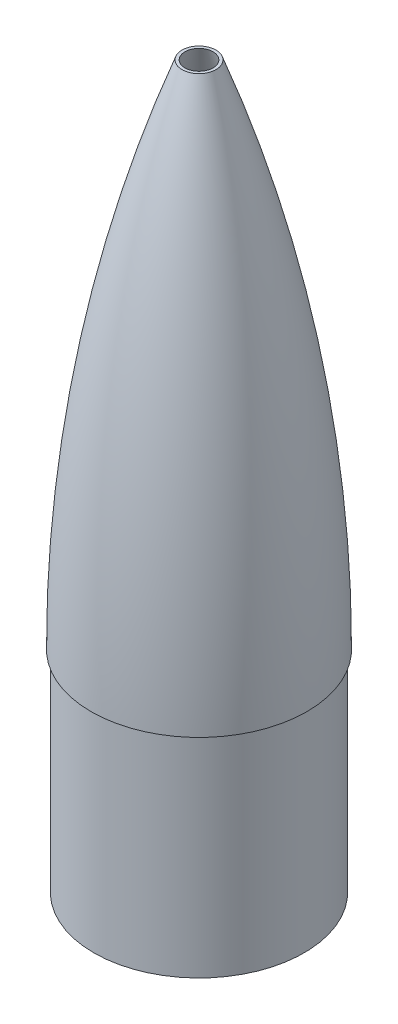
ISO-10303-21;
HEADER;
FILE_DESCRIPTION(('STEP AP214'),'2;1');
FILE_NAME('part.step','',(''),(''),'','','');
FILE_SCHEMA(('AUTOMOTIVE_DESIGN { 1 0 10303 214 1 1 1 1 }'));
ENDSEC;
DATA;
#1=APPLICATION_CONTEXT('core data for automotive mechanical design processes');
#2=APPLICATION_PROTOCOL_DEFINITION('international standard','automotive_design',2000,#1);
#3=PRODUCT_CONTEXT('',#1,'mechanical');
#4=PRODUCT('Part','Part','',(#3));
#5=PRODUCT_RELATED_PRODUCT_CATEGORY('part','',(#4));
#6=PRODUCT_DEFINITION_FORMATION('','',#4);
#7=PRODUCT_DEFINITION_CONTEXT('part definition',#1,'design');
#8=PRODUCT_DEFINITION('design','',#6,#7);
#9=PRODUCT_DEFINITION_SHAPE('','',#8);
#10=(LENGTH_UNIT() NAMED_UNIT(*) SI_UNIT(.MILLI.,.METRE.));
#11=(NAMED_UNIT(*) PLANE_ANGLE_UNIT() SI_UNIT($,.RADIAN.));
#12=(NAMED_UNIT(*) SI_UNIT($,.STERADIAN.) SOLID_ANGLE_UNIT());
#13=UNCERTAINTY_MEASURE_WITH_UNIT(LENGTH_MEASURE(1.E-05),#10,'distance_accuracy_value','');
#14=(GEOMETRIC_REPRESENTATION_CONTEXT(3) GLOBAL_UNCERTAINTY_ASSIGNED_CONTEXT((#13)) GLOBAL_UNIT_ASSIGNED_CONTEXT((#10,
#11,#12)) REPRESENTATION_CONTEXT('',''));
#15=CARTESIAN_POINT('',(0.,0.,0.));
#16=DIRECTION('',(0.,0.,1.));
#17=DIRECTION('',(1.,0.,0.));
#18=AXIS2_PLACEMENT_3D('',#15,#16,#17);
#19=CARTESIAN_POINT('',(0.,0.,0.));
#20=DIRECTION('',(0.,1.,0.));
#21=DIRECTION('',(0.,0.,1.));
#22=AXIS2_PLACEMENT_3D('',#19,#20,#21);
#23=DEGENERATE_TOROIDAL_SURFACE('',#22,993.420310811265,1071.62031081127,.F.);
#24=CARTESIAN_POINT('',(0.,370.,0.));
#25=DIRECTION('',(0.,-1.,0.));
#26=DIRECTION('',(0.,0.,-1.));
#27=AXIS2_PLACEMENT_3D('',#24,#25,#26);
#28=CIRCLE('',#27,12.2983827324279);
#29=CARTESIAN_POINT('',(0.,370.,-12.2983827324279));
#30=VERTEX_POINT('',#29);
#31=EDGE_CURVE('E68',#30,#30,#28,.T.);
#32=ORIENTED_EDGE('',*,*,#31,.T.);
#33=EDGE_LOOP('',(#32));
#34=FACE_BOUND('',#33,.T.);
#35=CARTESIAN_POINT('',(0.,0.,0.));
#36=DIRECTION('',(0.,1.,0.));
#37=DIRECTION('',(0.,0.,1.));
#38=AXIS2_PLACEMENT_3D('',#35,#36,#37);
#39=CIRCLE('',#38,78.2);
#40=CARTESIAN_POINT('',(0.,0.,78.2));
#41=VERTEX_POINT('',#40);
#42=EDGE_CURVE('E45',#41,#41,#39,.T.);
#43=ORIENTED_EDGE('',*,*,#42,.T.);
#44=EDGE_LOOP('',(#43));
#45=FACE_BOUND('',#44,.T.);
#46=ADVANCED_FACE('F37',(#34,#45),#23,.F.);
#47=CARTESIAN_POINT('',(78.2,0.,0.));
#48=DIRECTION('',(0.,-1.,0.));
#49=DIRECTION('',(0.,0.,-1.));
#50=AXIS2_PLACEMENT_3D('',#47,#48,#49);
#51=PLANE('',#50);
#52=CARTESIAN_POINT('',(0.,0.,0.));
#53=DIRECTION('',(0.,-1.,0.));
#54=DIRECTION('',(0.,0.,-1.));
#55=AXIS2_PLACEMENT_3D('',#52,#53,#54);
#56=CIRCLE('',#55,76.2);
#57=CARTESIAN_POINT('',(0.,0.,-76.2));
#58=VERTEX_POINT('',#57);
#59=EDGE_CURVE('E50',#58,#58,#56,.F.);
#60=ORIENTED_EDGE('',*,*,#59,.T.);
#61=EDGE_LOOP('',(#60));
#62=FACE_BOUND('',#61,.T.);
#63=ORIENTED_EDGE('',*,*,#42,.F.);
#64=EDGE_LOOP('',(#63));
#65=FACE_BOUND('',#64,.T.);
#66=ADVANCED_FACE('F94',(#62,#65),#51,.T.);
#67=CARTESIAN_POINT('',(0.,10.,0.));
#68=DIRECTION('',(0.,1.,0.));
#69=DIRECTION('',(0.,0.,1.));
#70=AXIS2_PLACEMENT_3D('',#67,#68,#69);
#71=PLANE('',#70);
#72=CARTESIAN_POINT('',(0.,10.,0.));
#73=DIRECTION('',(0.,1.,0.));
#74=DIRECTION('',(0.,0.,1.));
#75=AXIS2_PLACEMENT_3D('',#72,#73,#74);
#76=CIRCLE('',#75,74.2);
#77=CARTESIAN_POINT('',(0.,10.,74.2));
#78=VERTEX_POINT('',#77);
#79=EDGE_CURVE('E56',#78,#78,#76,.T.);
#80=ORIENTED_EDGE('',*,*,#79,.F.);
#81=EDGE_LOOP('',(#80));
#82=FACE_BOUND('',#81,.T.);
#83=CARTESIAN_POINT('',(0.,10.,0.));
#84=DIRECTION('',(0.,1.,0.));
#85=DIRECTION('',(0.,0.,1.));
#86=AXIS2_PLACEMENT_3D('',#83,#84,#85);
#87=CIRCLE('',#86,76.1532534188851);
#88=CARTESIAN_POINT('',(0.,10.,76.1532534188851));
#89=VERTEX_POINT('',#88);
#90=EDGE_CURVE('E10',#89,#89,#87,.T.);
#91=ORIENTED_EDGE('',*,*,#90,.T.);
#92=EDGE_LOOP('',(#91));
#93=FACE_BOUND('',#92,.T.);
#94=ADVANCED_FACE('F98',(#82,#93),#71,.T.);
#95=CARTESIAN_POINT('',(0.,10.,0.));
#96=DIRECTION('',(0.,-1.,0.));
#97=DIRECTION('',(0.,0.,-1.));
#98=AXIS2_PLACEMENT_3D('',#95,#96,#97);
#99=CYLINDRICAL_SURFACE('',#98,76.2);
#100=ORIENTED_EDGE('',*,*,#59,.F.);
#101=EDGE_LOOP('',(#100));
#102=FACE_BOUND('',#101,.T.);
#103=CARTESIAN_POINT('',(0.,-152.4,0.));
#104=DIRECTION('',(0.,1.,0.));
#105=DIRECTION('',(0.,0.,1.));
#106=AXIS2_PLACEMENT_3D('',#103,#104,#105);
#107=CIRCLE('',#106,76.2);
#108=CARTESIAN_POINT('',(0.,-152.4,76.2));
#109=VERTEX_POINT('',#108);
#110=EDGE_CURVE('E60',#109,#109,#107,.T.);
#111=ORIENTED_EDGE('',*,*,#110,.T.);
#112=EDGE_LOOP('',(#111));
#113=FACE_BOUND('',#112,.T.);
#114=ADVANCED_FACE('F106',(#102,#113),#99,.T.);
#115=CARTESIAN_POINT('',(0.,10.,0.));
#116=DIRECTION('',(0.,-1.,0.));
#117=DIRECTION('',(0.,0.,-1.));
#118=AXIS2_PLACEMENT_3D('',#115,#116,#117);
#119=CYLINDRICAL_SURFACE('',#118,74.2);
#120=ORIENTED_EDGE('',*,*,#79,.T.);
#121=EDGE_LOOP('',(#120));
#122=FACE_BOUND('',#121,.T.);
#123=CARTESIAN_POINT('',(0.,-152.4,0.));
#124=DIRECTION('',(0.,1.,0.));
#125=DIRECTION('',(0.,0.,1.));
#126=AXIS2_PLACEMENT_3D('',#123,#124,#125);
#127=CIRCLE('',#126,74.2);
#128=CARTESIAN_POINT('',(0.,-152.4,74.2));
#129=VERTEX_POINT('',#128);
#130=EDGE_CURVE('E64',#129,#129,#127,.T.);
#131=ORIENTED_EDGE('',*,*,#130,.F.);
#132=EDGE_LOOP('',(#131));
#133=FACE_BOUND('',#132,.T.);
#134=ADVANCED_FACE('F89',(#122,#133),#119,.F.);
#135=CARTESIAN_POINT('',(0.,-152.4,0.));
#136=DIRECTION('',(0.,1.,0.));
#137=DIRECTION('',(0.,0.,1.));
#138=AXIS2_PLACEMENT_3D('',#135,#136,#137);
#139=PLANE('',#138);
#140=ORIENTED_EDGE('',*,*,#130,.T.);
#141=EDGE_LOOP('',(#140));
#142=FACE_BOUND('',#141,.T.);
#143=ORIENTED_EDGE('',*,*,#110,.F.);
#144=EDGE_LOOP('',(#143));
#145=FACE_BOUND('',#144,.T.);
#146=ADVANCED_FACE('F83',(#142,#145),#139,.F.);
#147=CARTESIAN_POINT('',(0.,0.,0.));
#148=DIRECTION('',(0.,1.,0.));
#149=DIRECTION('',(0.,0.,1.));
#150=AXIS2_PLACEMENT_3D('',#147,#148,#149);
#151=DEGENERATE_TOROIDAL_SURFACE('',#150,993.420310811265,1069.62031081127,.F.);
#152=CARTESIAN_POINT('',(0.,370.,0.));
#153=DIRECTION('',(0.,-1.,0.));
#154=DIRECTION('',(0.,0.,-1.));
#155=AXIS2_PLACEMENT_3D('',#152,#153,#154);
#156=CIRCLE('',#155,10.1670592268335);
#157=CARTESIAN_POINT('',(0.,370.,-10.1670592268335));
#158=VERTEX_POINT('',#157);
#159=EDGE_CURVE('E40',#158,#158,#156,.T.);
#160=ORIENTED_EDGE('',*,*,#159,.F.);
#161=EDGE_LOOP('',(#160));
#162=FACE_BOUND('',#161,.T.);
#163=ORIENTED_EDGE('',*,*,#90,.F.);
#164=EDGE_LOOP('',(#163));
#165=FACE_BOUND('',#164,.T.);
#166=ADVANCED_FACE('F80',(#162,#165),#151,.T.);
#167=CARTESIAN_POINT('',(0.,370.,0.));
#168=DIRECTION('',(0.,-1.,0.));
#169=DIRECTION('',(0.,0.,-1.));
#170=AXIS2_PLACEMENT_3D('',#167,#168,#169);
#171=PLANE('',#170);
#172=ORIENTED_EDGE('',*,*,#159,.T.);
#173=EDGE_LOOP('',(#172));
#174=FACE_BOUND('',#173,.T.);
#175=ORIENTED_EDGE('',*,*,#31,.F.);
#176=EDGE_LOOP('',(#175));
#177=FACE_BOUND('',#176,.T.);
#178=ADVANCED_FACE('F77',(#174,#177),#171,.F.);
#179=CLOSED_SHELL('',(#46,#66,#94,#114,#134,#146,#166,#178));
#180=MANIFOLD_SOLID_BREP('B2',#179);
#181=ADVANCED_BREP_SHAPE_REPRESENTATION('',(#18,#180),#14);
#182=SHAPE_DEFINITION_REPRESENTATION(#9,#181);
ENDSEC;
END-ISO-10303-21;
